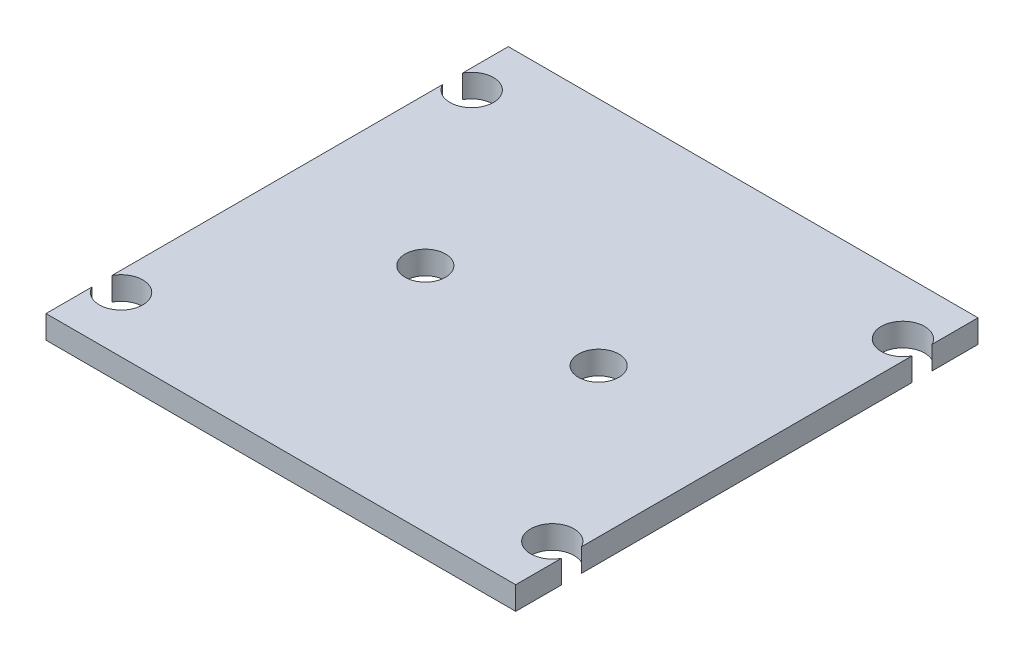
ISO-10303-21;
HEADER;
FILE_DESCRIPTION(('STEP AP214'),'2;1');
FILE_NAME('part.step','',(''),(''),'','','');
FILE_SCHEMA(('AUTOMOTIVE_DESIGN { 1 0 10303 214 1 1 1 1 }'));
ENDSEC;
DATA;
#1=APPLICATION_CONTEXT('core data for automotive mechanical design processes');
#2=APPLICATION_PROTOCOL_DEFINITION('international standard','automotive_design',2000,#1);
#3=PRODUCT_CONTEXT('',#1,'mechanical');
#4=PRODUCT('Part','Part','',(#3));
#5=PRODUCT_RELATED_PRODUCT_CATEGORY('part','',(#4));
#6=PRODUCT_DEFINITION_FORMATION('','',#4);
#7=PRODUCT_DEFINITION_CONTEXT('part definition',#1,'design');
#8=PRODUCT_DEFINITION('design','',#6,#7);
#9=PRODUCT_DEFINITION_SHAPE('','',#8);
#10=(LENGTH_UNIT() NAMED_UNIT(*) SI_UNIT(.MILLI.,.METRE.));
#11=(NAMED_UNIT(*) PLANE_ANGLE_UNIT() SI_UNIT($,.RADIAN.));
#12=(NAMED_UNIT(*) SI_UNIT($,.STERADIAN.) SOLID_ANGLE_UNIT());
#13=UNCERTAINTY_MEASURE_WITH_UNIT(LENGTH_MEASURE(1.E-05),#10,'distance_accuracy_value','');
#14=(GEOMETRIC_REPRESENTATION_CONTEXT(3) GLOBAL_UNCERTAINTY_ASSIGNED_CONTEXT((#13)) GLOBAL_UNIT_ASSIGNED_CONTEXT((#10,
#11,#12)) REPRESENTATION_CONTEXT('',''));
#15=CARTESIAN_POINT('',(0.,0.,0.));
#16=DIRECTION('',(0.,0.,1.));
#17=DIRECTION('',(1.,0.,0.));
#18=AXIS2_PLACEMENT_3D('',#15,#16,#17);
#19=CARTESIAN_POINT('',(20.32,1.999996,19.9999981));
#20=DIRECTION('',(-1.,0.,0.));
#21=DIRECTION('',(0.,0.,1.));
#22=AXIS2_PLACEMENT_3D('',#19,#20,#21);
#23=PLANE('',#22);
#24=DIRECTION('',(0.,0.,-1.));
#25=VECTOR('',#24,1.);
#26=CARTESIAN_POINT('',(20.32,0.,19.9999981));
#27=LINE('',#26,#25);
#28=CARTESIAN_POINT('',(20.32,0.,19.9999981));
#29=VERTEX_POINT('',#28);
#30=CARTESIAN_POINT('',(20.32,0.,16.033565593157));
#31=VERTEX_POINT('',#30);
#32=EDGE_CURVE('E214',#29,#31,#27,.T.);
#33=ORIENTED_EDGE('',*,*,#32,.T.);
#34=DIRECTION('',(0.,1.,0.));
#35=VECTOR('',#34,1.);
#36=CARTESIAN_POINT('',(20.32,0.,16.033565593157));
#37=LINE('',#36,#35);
#38=CARTESIAN_POINT('',(20.32,1.999996,16.033565593157));
#39=VERTEX_POINT('',#38);
#40=EDGE_CURVE('E196',#31,#39,#37,.T.);
#41=ORIENTED_EDGE('',*,*,#40,.T.);
#42=DIRECTION('',(0.,0.,-1.));
#43=VECTOR('',#42,1.);
#44=CARTESIAN_POINT('',(20.32,1.999996,19.9999981));
#45=LINE('',#44,#43);
#46=CARTESIAN_POINT('',(20.32,1.999996,19.9999981));
#47=VERTEX_POINT('',#46);
#48=EDGE_CURVE('E229',#47,#39,#45,.T.);
#49=ORIENTED_EDGE('',*,*,#48,.F.);
#50=DIRECTION('',(0.,-1.,0.));
#51=VECTOR('',#50,1.);
#52=CARTESIAN_POINT('',(20.32,1.999996,19.9999981));
#53=LINE('',#52,#51);
#54=EDGE_CURVE('E171',#47,#29,#53,.T.);
#55=ORIENTED_EDGE('',*,*,#54,.T.);
#56=EDGE_LOOP('',(#33,#41,#49,#55));
#57=FACE_BOUND('',#56,.T.);
#58=ADVANCED_FACE('F45',(#57),#23,.F.);
#59=CARTESIAN_POINT('',(20.32,1.999996,14.3014108546352));
#60=VERTEX_POINT('',#59);
#61=CARTESIAN_POINT('',(20.32,1.999996,-14.3014108546352));
#62=VERTEX_POINT('',#61);
#63=EDGE_CURVE('E207',#60,#62,#45,.T.);
#64=ORIENTED_EDGE('',*,*,#63,.F.);
#65=DIRECTION('',(0.,1.,0.));
#66=VECTOR('',#65,1.);
#67=CARTESIAN_POINT('',(20.32,0.,14.3014108546352));
#68=LINE('',#67,#66);
#69=CARTESIAN_POINT('',(20.32,0.,14.3014108546352));
#70=VERTEX_POINT('',#69);
#71=EDGE_CURVE('E193',#60,#70,#68,.F.);
#72=ORIENTED_EDGE('',*,*,#71,.T.);
#73=CARTESIAN_POINT('',(20.32,0.,-14.3014108546352));
#74=VERTEX_POINT('',#73);
#75=EDGE_CURVE('E205',#70,#74,#27,.T.);
#76=ORIENTED_EDGE('',*,*,#75,.T.);
#77=DIRECTION('',(0.,1.,0.));
#78=VECTOR('',#77,1.);
#79=CARTESIAN_POINT('',(20.32,0.,-14.3014108546352));
#80=LINE('',#79,#78);
#81=EDGE_CURVE('E247',#74,#62,#80,.T.);
#82=ORIENTED_EDGE('',*,*,#81,.T.);
#83=EDGE_LOOP('',(#64,#72,#76,#82));
#84=FACE_BOUND('',#83,.T.);
#85=ADVANCED_FACE('F203',(#84),#23,.F.);
#86=CARTESIAN_POINT('',(-20.32,1.999996,19.9999981));
#87=DIRECTION('',(1.,0.,0.));
#88=DIRECTION('',(0.,0.,-1.));
#89=AXIS2_PLACEMENT_3D('',#86,#87,#88);
#90=PLANE('',#89);
#91=DIRECTION('',(0.,0.,1.));
#92=VECTOR('',#91,1.);
#93=CARTESIAN_POINT('',(-20.32,0.,19.9999981));
#94=LINE('',#93,#92);
#95=CARTESIAN_POINT('',(-20.32,0.,-14.3014108546351));
#96=VERTEX_POINT('',#95);
#97=CARTESIAN_POINT('',(-20.32,0.,14.3014108546351));
#98=VERTEX_POINT('',#97);
#99=EDGE_CURVE('E148',#96,#98,#94,.T.);
#100=ORIENTED_EDGE('',*,*,#99,.T.);
#101=DIRECTION('',(0.,1.,0.));
#102=VECTOR('',#101,1.);
#103=CARTESIAN_POINT('',(-20.32,0.,14.3014108546351));
#104=LINE('',#103,#102);
#105=CARTESIAN_POINT('',(-20.32,1.999996,14.3014108546351));
#106=VERTEX_POINT('',#105);
#107=EDGE_CURVE('E60',#98,#106,#104,.T.);
#108=ORIENTED_EDGE('',*,*,#107,.T.);
#109=DIRECTION('',(0.,0.,1.));
#110=VECTOR('',#109,1.);
#111=CARTESIAN_POINT('',(-20.32,1.999996,19.9999981));
#112=LINE('',#111,#110);
#113=CARTESIAN_POINT('',(-20.32,1.999996,-14.3014108546351));
#114=VERTEX_POINT('',#113);
#115=EDGE_CURVE('E150',#114,#106,#112,.T.);
#116=ORIENTED_EDGE('',*,*,#115,.F.);
#117=DIRECTION('',(0.,1.,0.));
#118=VECTOR('',#117,1.);
#119=CARTESIAN_POINT('',(-20.32,0.,-14.3014108546351));
#120=LINE('',#119,#118);
#121=EDGE_CURVE('E134',#114,#96,#120,.F.);
#122=ORIENTED_EDGE('',*,*,#121,.T.);
#123=EDGE_LOOP('',(#100,#108,#116,#122));
#124=FACE_BOUND('',#123,.T.);
#125=ADVANCED_FACE('F147',(#124),#90,.F.);
#126=CARTESIAN_POINT('',(-20.32,0.,-19.9999981));
#127=VERTEX_POINT('',#126);
#128=CARTESIAN_POINT('',(-20.32,0.,-16.033565593157));
#129=VERTEX_POINT('',#128);
#130=EDGE_CURVE('E158',#127,#129,#94,.T.);
#131=ORIENTED_EDGE('',*,*,#130,.T.);
#132=DIRECTION('',(0.,1.,0.));
#133=VECTOR('',#132,1.);
#134=CARTESIAN_POINT('',(-20.32,0.,-16.033565593157));
#135=LINE('',#134,#133);
#136=CARTESIAN_POINT('',(-20.32,1.999996,-16.033565593157));
#137=VERTEX_POINT('',#136);
#138=EDGE_CURVE('E68',#129,#137,#135,.T.);
#139=ORIENTED_EDGE('',*,*,#138,.T.);
#140=CARTESIAN_POINT('',(-20.32,1.999996,-19.9999981));
#141=VERTEX_POINT('',#140);
#142=EDGE_CURVE('E221',#141,#137,#112,.T.);
#143=ORIENTED_EDGE('',*,*,#142,.F.);
#144=DIRECTION('',(0.,-1.,0.));
#145=VECTOR('',#144,1.);
#146=CARTESIAN_POINT('',(-20.32,1.999996,-19.9999981));
#147=LINE('',#146,#145);
#148=EDGE_CURVE('E180',#141,#127,#147,.T.);
#149=ORIENTED_EDGE('',*,*,#148,.T.);
#150=EDGE_LOOP('',(#131,#139,#143,#149));
#151=FACE_BOUND('',#150,.T.);
#152=ADVANCED_FACE('F318',(#151),#90,.F.);
#153=CARTESIAN_POINT('',(20.32,1.999996,-16.033565593157));
#154=VERTEX_POINT('',#153);
#155=CARTESIAN_POINT('',(20.32,1.999996,-19.9999981));
#156=VERTEX_POINT('',#155);
#157=EDGE_CURVE('E170',#154,#156,#45,.T.);
#158=ORIENTED_EDGE('',*,*,#157,.F.);
#159=DIRECTION('',(0.,1.,0.));
#160=VECTOR('',#159,1.);
#161=CARTESIAN_POINT('',(20.32,0.,-16.033565593157));
#162=LINE('',#161,#160);
#163=CARTESIAN_POINT('',(20.32,0.,-16.033565593157));
#164=VERTEX_POINT('',#163);
#165=EDGE_CURVE('E250',#154,#164,#162,.F.);
#166=ORIENTED_EDGE('',*,*,#165,.T.);
#167=CARTESIAN_POINT('',(20.32,0.,-19.9999981));
#168=VERTEX_POINT('',#167);
#169=EDGE_CURVE('E215',#164,#168,#27,.T.);
#170=ORIENTED_EDGE('',*,*,#169,.T.);
#171=DIRECTION('',(0.,-1.,0.));
#172=VECTOR('',#171,1.);
#173=CARTESIAN_POINT('',(20.32,1.999996,-19.9999981));
#174=LINE('',#173,#172);
#175=EDGE_CURVE('E142',#156,#168,#174,.T.);
#176=ORIENTED_EDGE('',*,*,#175,.F.);
#177=EDGE_LOOP('',(#158,#166,#170,#176));
#178=FACE_BOUND('',#177,.T.);
#179=ADVANCED_FACE('F47',(#178),#23,.F.);
#180=CARTESIAN_POINT('',(-20.32,1.999996,-19.9999981));
#181=DIRECTION('',(0.,0.,1.));
#182=DIRECTION('',(1.,0.,0.));
#183=AXIS2_PLACEMENT_3D('',#180,#181,#182);
#184=PLANE('',#183);
#185=DIRECTION('',(-1.,0.,0.));
#186=VECTOR('',#185,1.);
#187=CARTESIAN_POINT('',(-20.32,0.,-19.9999981));
#188=LINE('',#187,#186);
#189=EDGE_CURVE('E164',#168,#127,#188,.T.);
#190=ORIENTED_EDGE('',*,*,#189,.T.);
#191=ORIENTED_EDGE('',*,*,#148,.F.);
#192=DIRECTION('',(-1.,0.,0.));
#193=VECTOR('',#192,1.);
#194=CARTESIAN_POINT('',(-20.32,1.999996,-19.9999981));
#195=LINE('',#194,#193);
#196=EDGE_CURVE('E226',#156,#141,#195,.T.);
#197=ORIENTED_EDGE('',*,*,#196,.F.);
#198=ORIENTED_EDGE('',*,*,#175,.T.);
#199=EDGE_LOOP('',(#190,#191,#197,#198));
#200=FACE_BOUND('',#199,.T.);
#201=ADVANCED_FACE('F313',(#200),#184,.F.);
#202=CARTESIAN_POINT('',(-20.32,1.999996,16.033565593157));
#203=VERTEX_POINT('',#202);
#204=CARTESIAN_POINT('',(-20.32,1.999996,19.9999981));
#205=VERTEX_POINT('',#204);
#206=EDGE_CURVE('E225',#203,#205,#112,.T.);
#207=ORIENTED_EDGE('',*,*,#206,.F.);
#208=DIRECTION('',(0.,1.,0.));
#209=VECTOR('',#208,1.);
#210=CARTESIAN_POINT('',(-20.32,0.,16.033565593157));
#211=LINE('',#210,#209);
#212=CARTESIAN_POINT('',(-20.32,0.,16.033565593157));
#213=VERTEX_POINT('',#212);
#214=EDGE_CURVE('E235',#203,#213,#211,.F.);
#215=ORIENTED_EDGE('',*,*,#214,.T.);
#216=CARTESIAN_POINT('',(-20.32,0.,19.9999981));
#217=VERTEX_POINT('',#216);
#218=EDGE_CURVE('E159',#213,#217,#94,.T.);
#219=ORIENTED_EDGE('',*,*,#218,.T.);
#220=DIRECTION('',(0.,-1.,0.));
#221=VECTOR('',#220,1.);
#222=CARTESIAN_POINT('',(-20.32,1.999996,19.9999981));
#223=LINE('',#222,#221);
#224=EDGE_CURVE('E175',#205,#217,#223,.T.);
#225=ORIENTED_EDGE('',*,*,#224,.F.);
#226=EDGE_LOOP('',(#207,#215,#219,#225));
#227=FACE_BOUND('',#226,.T.);
#228=ADVANCED_FACE('F300',(#227),#90,.F.);
#229=CARTESIAN_POINT('',(-20.32,1.999996,19.9999981));
#230=DIRECTION('',(0.,0.,-1.));
#231=DIRECTION('',(-1.,0.,0.));
#232=AXIS2_PLACEMENT_3D('',#229,#230,#231);
#233=PLANE('',#232);
#234=DIRECTION('',(1.,0.,0.));
#235=VECTOR('',#234,1.);
#236=CARTESIAN_POINT('',(-20.32,0.,19.9999981));
#237=LINE('',#236,#235);
#238=EDGE_CURVE('E163',#217,#29,#237,.T.);
#239=ORIENTED_EDGE('',*,*,#238,.T.);
#240=ORIENTED_EDGE('',*,*,#54,.F.);
#241=DIRECTION('',(1.,0.,0.));
#242=VECTOR('',#241,1.);
#243=CARTESIAN_POINT('',(-20.32,1.999996,19.9999981));
#244=LINE('',#243,#242);
#245=EDGE_CURVE('E176',#205,#47,#244,.T.);
#246=ORIENTED_EDGE('',*,*,#245,.F.);
#247=ORIENTED_EDGE('',*,*,#224,.T.);
#248=EDGE_LOOP('',(#239,#240,#246,#247));
#249=FACE_BOUND('',#248,.T.);
#250=ADVANCED_FACE('F290',(#249),#233,.F.);
#251=CARTESIAN_POINT('',(0.,1.999996,0.));
#252=DIRECTION('',(0.,-1.,0.));
#253=DIRECTION('',(0.,0.,-1.));
#254=AXIS2_PLACEMENT_3D('',#251,#252,#253);
#255=PLANE('',#254);
#256=CARTESIAN_POINT('',(-7.49798917370209,1.999996,0.));
#257=DIRECTION('',(0.,-1.,0.));
#258=DIRECTION('',(0.,0.,-1.));
#259=AXIS2_PLACEMENT_3D('',#256,#257,#258);
#260=CIRCLE('',#259,1.74916022629792);
#261=CARTESIAN_POINT('',(-7.49798917370209,1.999996,-1.74916022629791));
#262=VERTEX_POINT('',#261);
#263=EDGE_CURVE('E258',#262,#262,#260,.T.);
#264=ORIENTED_EDGE('',*,*,#263,.T.);
#265=EDGE_LOOP('',(#264));
#266=FACE_BOUND('',#265,.T.);
#267=CARTESIAN_POINT('',(7.49798917370209,1.999996,0.));
#268=DIRECTION('',(0.,-1.,0.));
#269=DIRECTION('',(0.,0.,-1.));
#270=AXIS2_PLACEMENT_3D('',#267,#268,#269);
#271=CIRCLE('',#270,1.74916022629792);
#272=CARTESIAN_POINT('',(7.49798917370209,1.999996,-1.74916022629791));
#273=VERTEX_POINT('',#272);
#274=EDGE_CURVE('E262',#273,#273,#271,.T.);
#275=ORIENTED_EDGE('',*,*,#274,.T.);
#276=EDGE_LOOP('',(#275));
#277=FACE_BOUND('',#276,.T.);
#278=ORIENTED_EDGE('',*,*,#115,.T.);
#279=CARTESIAN_POINT('',(-18.6541706476109,1.999996,15.1674882238961));
#280=DIRECTION('',(0.,-1.,0.));
#281=DIRECTION('',(0.,0.,-1.));
#282=AXIS2_PLACEMENT_3D('',#279,#280,#281);
#283=CIRCLE('',#282,1.87751895884625);
#284=EDGE_CURVE('E239',#106,#203,#283,.T.);
#285=ORIENTED_EDGE('',*,*,#284,.T.);
#286=ORIENTED_EDGE('',*,*,#206,.T.);
#287=ORIENTED_EDGE('',*,*,#245,.T.);
#288=ORIENTED_EDGE('',*,*,#48,.T.);
#289=CARTESIAN_POINT('',(18.6541706476109,1.999996,15.1674882238961));
#290=DIRECTION('',(0.,-1.,0.));
#291=DIRECTION('',(0.,0.,-1.));
#292=AXIS2_PLACEMENT_3D('',#289,#290,#291);
#293=CIRCLE('',#292,1.87751895884625);
#294=EDGE_CURVE('E209',#39,#60,#293,.T.);
#295=ORIENTED_EDGE('',*,*,#294,.T.);
#296=ORIENTED_EDGE('',*,*,#63,.T.);
#297=CARTESIAN_POINT('',(18.6541706476109,1.999996,-15.1674882238961));
#298=DIRECTION('',(0.,-1.,0.));
#299=DIRECTION('',(0.,0.,-1.));
#300=AXIS2_PLACEMENT_3D('',#297,#298,#299);
#301=CIRCLE('',#300,1.87751895884625);
#302=EDGE_CURVE('E254',#62,#154,#301,.T.);
#303=ORIENTED_EDGE('',*,*,#302,.T.);
#304=ORIENTED_EDGE('',*,*,#157,.T.);
#305=ORIENTED_EDGE('',*,*,#196,.T.);
#306=ORIENTED_EDGE('',*,*,#142,.T.);
#307=CARTESIAN_POINT('',(-18.6541706476109,1.999996,-15.1674882238961));
#308=DIRECTION('',(0.,-1.,0.));
#309=DIRECTION('',(0.,0.,-1.));
#310=AXIS2_PLACEMENT_3D('',#307,#308,#309);
#311=CIRCLE('',#310,1.87751895884625);
#312=EDGE_CURVE('E152',#137,#114,#311,.T.);
#313=ORIENTED_EDGE('',*,*,#312,.T.);
#314=EDGE_LOOP('',(#278,#285,#286,#287,#288,#295,#296,#303,#304,#305,#306,#313));
#315=FACE_BOUND('',#314,.T.);
#316=ADVANCED_FACE('F287',(#266,#277,#315),#255,.F.);
#317=CARTESIAN_POINT('',(0.,0.,0.));
#318=DIRECTION('',(0.,-1.,0.));
#319=DIRECTION('',(0.,0.,-1.));
#320=AXIS2_PLACEMENT_3D('',#317,#318,#319);
#321=PLANE('',#320);
#322=CARTESIAN_POINT('',(-18.6541706476109,0.,15.1674882238961));
#323=DIRECTION('',(0.,-1.,0.));
#324=DIRECTION('',(0.,0.,-1.));
#325=AXIS2_PLACEMENT_3D('',#322,#323,#324);
#326=CIRCLE('',#325,1.87751895884625);
#327=EDGE_CURVE('E11',#98,#213,#326,.T.);
#328=ORIENTED_EDGE('',*,*,#327,.F.);
#329=ORIENTED_EDGE('',*,*,#99,.F.);
#330=CARTESIAN_POINT('',(-18.6541706476109,0.,-15.1674882238961));
#331=DIRECTION('',(0.,-1.,0.));
#332=DIRECTION('',(0.,0.,-1.));
#333=AXIS2_PLACEMENT_3D('',#330,#331,#332);
#334=CIRCLE('',#333,1.87751895884625);
#335=EDGE_CURVE('E131',#129,#96,#334,.T.);
#336=ORIENTED_EDGE('',*,*,#335,.F.);
#337=ORIENTED_EDGE('',*,*,#130,.F.);
#338=ORIENTED_EDGE('',*,*,#189,.F.);
#339=ORIENTED_EDGE('',*,*,#169,.F.);
#340=CARTESIAN_POINT('',(18.6541706476109,0.,-15.1674882238961));
#341=DIRECTION('',(0.,-1.,0.));
#342=DIRECTION('',(0.,0.,-1.));
#343=AXIS2_PLACEMENT_3D('',#340,#341,#342);
#344=CIRCLE('',#343,1.87751895884625);
#345=EDGE_CURVE('E141',#74,#164,#344,.T.);
#346=ORIENTED_EDGE('',*,*,#345,.F.);
#347=ORIENTED_EDGE('',*,*,#75,.F.);
#348=CARTESIAN_POINT('',(18.6541706476109,0.,15.1674882238961));
#349=DIRECTION('',(0.,-1.,0.));
#350=DIRECTION('',(0.,0.,-1.));
#351=AXIS2_PLACEMENT_3D('',#348,#349,#350);
#352=CIRCLE('',#351,1.87751895884625);
#353=EDGE_CURVE('E54',#31,#70,#352,.T.);
#354=ORIENTED_EDGE('',*,*,#353,.F.);
#355=ORIENTED_EDGE('',*,*,#32,.F.);
#356=ORIENTED_EDGE('',*,*,#238,.F.);
#357=ORIENTED_EDGE('',*,*,#218,.F.);
#358=EDGE_LOOP('',(#328,#329,#336,#337,#338,#339,#346,#347,#354,#355,#356,#357));
#359=FACE_BOUND('',#358,.T.);
#360=CARTESIAN_POINT('',(-7.49798917370209,0.,0.));
#361=DIRECTION('',(0.,1.,0.));
#362=DIRECTION('',(0.,0.,1.));
#363=AXIS2_PLACEMENT_3D('',#360,#361,#362);
#364=CIRCLE('',#363,1.74916022629792);
#365=CARTESIAN_POINT('',(-7.49798917370209,0.,1.74916022629792));
#366=VERTEX_POINT('',#365);
#367=EDGE_CURVE('E270',#366,#366,#364,.T.);
#368=ORIENTED_EDGE('',*,*,#367,.T.);
#369=EDGE_LOOP('',(#368));
#370=FACE_BOUND('',#369,.T.);
#371=CARTESIAN_POINT('',(7.49798917370209,0.,0.));
#372=DIRECTION('',(0.,1.,0.));
#373=DIRECTION('',(0.,0.,-1.));
#374=AXIS2_PLACEMENT_3D('',#371,#372,#373);
#375=CIRCLE('',#374,1.74916022629792);
#376=CARTESIAN_POINT('',(7.49798917370209,0.,-1.74916022629791));
#377=VERTEX_POINT('',#376);
#378=EDGE_CURVE('E274',#377,#377,#375,.T.);
#379=ORIENTED_EDGE('',*,*,#378,.T.);
#380=EDGE_LOOP('',(#379));
#381=FACE_BOUND('',#380,.T.);
#382=ADVANCED_FACE('F154',(#359,#370,#381),#321,.T.);
#383=CARTESIAN_POINT('',(-18.6541706476109,0.,-15.1674882238961));
#384=DIRECTION('',(0.,1.,0.));
#385=DIRECTION('',(0.,0.,1.));
#386=AXIS2_PLACEMENT_3D('',#383,#384,#385);
#387=CYLINDRICAL_SURFACE('',#386,1.87751895884625);
#388=ORIENTED_EDGE('',*,*,#335,.T.);
#389=ORIENTED_EDGE('',*,*,#121,.F.);
#390=ORIENTED_EDGE('',*,*,#312,.F.);
#391=ORIENTED_EDGE('',*,*,#138,.F.);
#392=EDGE_LOOP('',(#388,#389,#390,#391));
#393=FACE_BOUND('',#392,.T.);
#394=ADVANCED_FACE('F133',(#393),#387,.F.);
#395=CARTESIAN_POINT('',(7.49798917370209,0.,0.));
#396=DIRECTION('',(0.,1.,0.));
#397=DIRECTION('',(0.,0.,1.));
#398=AXIS2_PLACEMENT_3D('',#395,#396,#397);
#399=CYLINDRICAL_SURFACE('',#398,1.74916022629792);
#400=ORIENTED_EDGE('',*,*,#378,.F.);
#401=EDGE_LOOP('',(#400));
#402=FACE_BOUND('',#401,.T.);
#403=ORIENTED_EDGE('',*,*,#274,.F.);
#404=EDGE_LOOP('',(#403));
#405=FACE_BOUND('',#404,.T.);
#406=ADVANCED_FACE('F280',(#402,#405),#399,.F.);
#407=CARTESIAN_POINT('',(-7.49798917370209,0.,0.));
#408=DIRECTION('',(0.,1.,0.));
#409=DIRECTION('',(0.,0.,1.));
#410=AXIS2_PLACEMENT_3D('',#407,#408,#409);
#411=CYLINDRICAL_SURFACE('',#410,1.74916022629792);
#412=ORIENTED_EDGE('',*,*,#367,.F.);
#413=EDGE_LOOP('',(#412));
#414=FACE_BOUND('',#413,.T.);
#415=ORIENTED_EDGE('',*,*,#263,.F.);
#416=EDGE_LOOP('',(#415));
#417=FACE_BOUND('',#416,.T.);
#418=ADVANCED_FACE('F283',(#414,#417),#411,.F.);
#419=CARTESIAN_POINT('',(18.6541706476109,0.,-15.1674882238961));
#420=DIRECTION('',(0.,1.,0.));
#421=DIRECTION('',(0.,0.,1.));
#422=AXIS2_PLACEMENT_3D('',#419,#420,#421);
#423=CYLINDRICAL_SURFACE('',#422,1.87751895884625);
#424=ORIENTED_EDGE('',*,*,#345,.T.);
#425=ORIENTED_EDGE('',*,*,#165,.F.);
#426=ORIENTED_EDGE('',*,*,#302,.F.);
#427=ORIENTED_EDGE('',*,*,#81,.F.);
#428=EDGE_LOOP('',(#424,#425,#426,#427));
#429=FACE_BOUND('',#428,.T.);
#430=ADVANCED_FACE('F400',(#429),#423,.F.);
#431=CARTESIAN_POINT('',(18.6541706476109,0.,15.1674882238961));
#432=DIRECTION('',(0.,1.,0.));
#433=DIRECTION('',(0.,0.,1.));
#434=AXIS2_PLACEMENT_3D('',#431,#432,#433);
#435=CYLINDRICAL_SURFACE('',#434,1.87751895884625);
#436=ORIENTED_EDGE('',*,*,#353,.T.);
#437=ORIENTED_EDGE('',*,*,#71,.F.);
#438=ORIENTED_EDGE('',*,*,#294,.F.);
#439=ORIENTED_EDGE('',*,*,#40,.F.);
#440=EDGE_LOOP('',(#436,#437,#438,#439));
#441=FACE_BOUND('',#440,.T.);
#442=ADVANCED_FACE('F192',(#441),#435,.F.);
#443=CARTESIAN_POINT('',(-18.6541706476109,0.,15.1674882238961));
#444=DIRECTION('',(0.,1.,0.));
#445=DIRECTION('',(0.,0.,1.));
#446=AXIS2_PLACEMENT_3D('',#443,#444,#445);
#447=CYLINDRICAL_SURFACE('',#446,1.87751895884625);
#448=ORIENTED_EDGE('',*,*,#327,.T.);
#449=ORIENTED_EDGE('',*,*,#214,.F.);
#450=ORIENTED_EDGE('',*,*,#284,.F.);
#451=ORIENTED_EDGE('',*,*,#107,.F.);
#452=EDGE_LOOP('',(#448,#449,#450,#451));
#453=FACE_BOUND('',#452,.T.);
#454=ADVANCED_FACE('F417',(#453),#447,.F.);
#455=CLOSED_SHELL('',(#58,#85,#125,#152,#179,#201,#228,#250,#316,#382,#394,#406,#418,#430,#442,#454));
#456=MANIFOLD_SOLID_BREP('B2',#455);
#457=ADVANCED_BREP_SHAPE_REPRESENTATION('',(#18,#456),#14);
#458=SHAPE_DEFINITION_REPRESENTATION(#9,#457);
ENDSEC;
END-ISO-10303-21;
